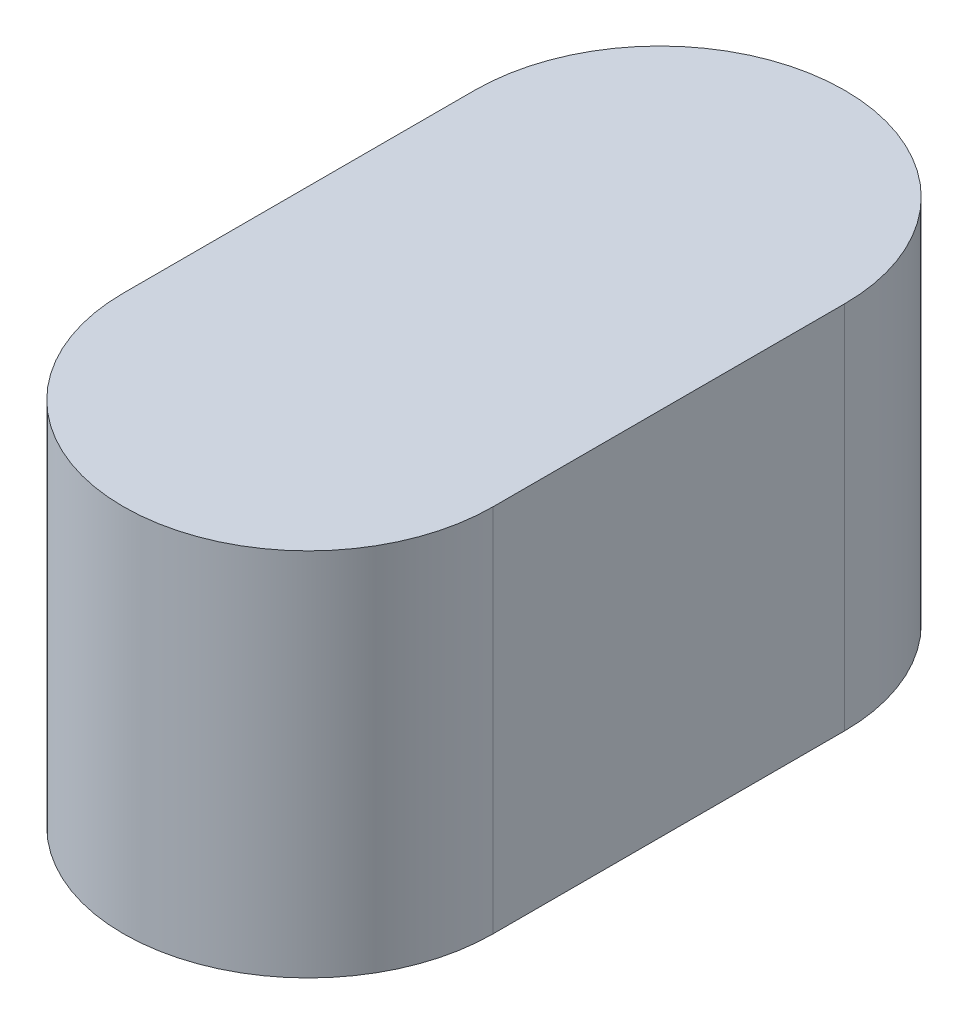
ISO-10303-21;
HEADER;
FILE_DESCRIPTION(('STEP AP214'),'2;1');
FILE_NAME('part.step','',(''),(''),'','','');
FILE_SCHEMA(('AUTOMOTIVE_DESIGN { 1 0 10303 214 1 1 1 1 }'));
ENDSEC;
DATA;
#1=APPLICATION_CONTEXT('core data for automotive mechanical design processes');
#2=APPLICATION_PROTOCOL_DEFINITION('international standard','automotive_design',2000,#1);
#3=PRODUCT_CONTEXT('',#1,'mechanical');
#4=PRODUCT('Part','Part','',(#3));
#5=PRODUCT_RELATED_PRODUCT_CATEGORY('part','',(#4));
#6=PRODUCT_DEFINITION_FORMATION('','',#4);
#7=PRODUCT_DEFINITION_CONTEXT('part definition',#1,'design');
#8=PRODUCT_DEFINITION('design','',#6,#7);
#9=PRODUCT_DEFINITION_SHAPE('','',#8);
#10=(LENGTH_UNIT() NAMED_UNIT(*) SI_UNIT(.MILLI.,.METRE.));
#11=(NAMED_UNIT(*) PLANE_ANGLE_UNIT() SI_UNIT($,.RADIAN.));
#12=(NAMED_UNIT(*) SI_UNIT($,.STERADIAN.) SOLID_ANGLE_UNIT());
#13=UNCERTAINTY_MEASURE_WITH_UNIT(LENGTH_MEASURE(1.E-05),#10,'distance_accuracy_value','');
#14=(GEOMETRIC_REPRESENTATION_CONTEXT(3) GLOBAL_UNCERTAINTY_ASSIGNED_CONTEXT((#13)) GLOBAL_UNIT_ASSIGNED_CONTEXT((#10,
#11,#12)) REPRESENTATION_CONTEXT('',''));
#15=CARTESIAN_POINT('',(0.,0.,0.));
#16=DIRECTION('',(0.,0.,1.));
#17=DIRECTION('',(1.,0.,0.));
#18=AXIS2_PLACEMENT_3D('',#15,#16,#17);
#19=CARTESIAN_POINT('',(0.,4.,-1.9));
#20=DIRECTION('',(0.,-1.,0.));
#21=DIRECTION('',(0.,0.,-1.));
#22=AXIS2_PLACEMENT_3D('',#19,#20,#21);
#23=CYLINDRICAL_SURFACE('',#22,2.);
#24=CARTESIAN_POINT('',(0.,0.,-1.9));
#25=DIRECTION('',(0.,1.,0.));
#26=DIRECTION('',(0.,0.,1.));
#27=AXIS2_PLACEMENT_3D('',#24,#25,#26);
#28=CIRCLE('',#27,2.);
#29=CARTESIAN_POINT('',(2.,0.,-1.9));
#30=VERTEX_POINT('',#29);
#31=CARTESIAN_POINT('',(-2.,0.,-1.9));
#32=VERTEX_POINT('',#31);
#33=EDGE_CURVE('E96',#30,#32,#28,.T.);
#34=ORIENTED_EDGE('',*,*,#33,.T.);
#35=DIRECTION('',(0.,-1.,0.));
#36=VECTOR('',#35,1.);
#37=CARTESIAN_POINT('',(-2.,4.,-1.9));
#38=LINE('',#37,#36);
#39=CARTESIAN_POINT('',(-2.,4.,-1.9));
#40=VERTEX_POINT('',#39);
#41=EDGE_CURVE('E11',#40,#32,#38,.T.);
#42=ORIENTED_EDGE('',*,*,#41,.F.);
#43=CARTESIAN_POINT('',(0.,4.,-1.9));
#44=DIRECTION('',(0.,1.,0.));
#45=DIRECTION('',(0.,0.,1.));
#46=AXIS2_PLACEMENT_3D('',#43,#44,#45);
#47=CIRCLE('',#46,2.);
#48=CARTESIAN_POINT('',(2.,4.,-1.9));
#49=VERTEX_POINT('',#48);
#50=EDGE_CURVE('E84',#49,#40,#47,.T.);
#51=ORIENTED_EDGE('',*,*,#50,.F.);
#52=DIRECTION('',(0.,-1.,0.));
#53=VECTOR('',#52,1.);
#54=CARTESIAN_POINT('',(2.,4.,-1.9));
#55=LINE('',#54,#53);
#56=EDGE_CURVE('E92',#49,#30,#55,.T.);
#57=ORIENTED_EDGE('',*,*,#56,.T.);
#58=EDGE_LOOP('',(#34,#42,#51,#57));
#59=FACE_BOUND('',#58,.T.);
#60=ADVANCED_FACE('F33',(#59),#23,.T.);
#61=CARTESIAN_POINT('',(-2.,4.,-1.9));
#62=DIRECTION('',(1.,0.,0.));
#63=DIRECTION('',(0.,0.,-1.));
#64=AXIS2_PLACEMENT_3D('',#61,#62,#63);
#65=PLANE('',#64);
#66=DIRECTION('',(0.,0.,1.));
#67=VECTOR('',#66,1.);
#68=CARTESIAN_POINT('',(-2.,0.,-1.9));
#69=LINE('',#68,#67);
#70=CARTESIAN_POINT('',(-2.,0.,1.9));
#71=VERTEX_POINT('',#70);
#72=EDGE_CURVE('E88',#32,#71,#69,.T.);
#73=ORIENTED_EDGE('',*,*,#72,.T.);
#74=DIRECTION('',(0.,-1.,0.));
#75=VECTOR('',#74,1.);
#76=CARTESIAN_POINT('',(-2.,4.,1.9));
#77=LINE('',#76,#75);
#78=CARTESIAN_POINT('',(-2.,4.,1.9));
#79=VERTEX_POINT('',#78);
#80=EDGE_CURVE('E41',#79,#71,#77,.T.);
#81=ORIENTED_EDGE('',*,*,#80,.F.);
#82=DIRECTION('',(0.,0.,1.));
#83=VECTOR('',#82,1.);
#84=CARTESIAN_POINT('',(-2.,4.,-1.9));
#85=LINE('',#84,#83);
#86=EDGE_CURVE('E79',#40,#79,#85,.T.);
#87=ORIENTED_EDGE('',*,*,#86,.F.);
#88=ORIENTED_EDGE('',*,*,#41,.T.);
#89=EDGE_LOOP('',(#73,#81,#87,#88));
#90=FACE_BOUND('',#89,.T.);
#91=ADVANCED_FACE('F87',(#90),#65,.F.);
#92=CARTESIAN_POINT('',(0.,4.,1.9));
#93=DIRECTION('',(0.,-1.,0.));
#94=DIRECTION('',(0.,0.,-1.));
#95=AXIS2_PLACEMENT_3D('',#92,#93,#94);
#96=CYLINDRICAL_SURFACE('',#95,2.);
#97=CARTESIAN_POINT('',(0.,0.,1.9));
#98=DIRECTION('',(0.,1.,0.));
#99=DIRECTION('',(0.,0.,1.));
#100=AXIS2_PLACEMENT_3D('',#97,#98,#99);
#101=CIRCLE('',#100,2.);
#102=CARTESIAN_POINT('',(2.,0.,1.9));
#103=VERTEX_POINT('',#102);
#104=EDGE_CURVE('E66',#71,#103,#101,.T.);
#105=ORIENTED_EDGE('',*,*,#104,.T.);
#106=DIRECTION('',(0.,-1.,0.));
#107=VECTOR('',#106,1.);
#108=CARTESIAN_POINT('',(2.,4.,1.9));
#109=LINE('',#108,#107);
#110=CARTESIAN_POINT('',(2.,4.,1.9));
#111=VERTEX_POINT('',#110);
#112=EDGE_CURVE('E89',#111,#103,#109,.T.);
#113=ORIENTED_EDGE('',*,*,#112,.F.);
#114=CARTESIAN_POINT('',(0.,4.,1.9));
#115=DIRECTION('',(0.,1.,0.));
#116=DIRECTION('',(0.,0.,1.));
#117=AXIS2_PLACEMENT_3D('',#114,#115,#116);
#118=CIRCLE('',#117,2.);
#119=EDGE_CURVE('E82',#79,#111,#118,.T.);
#120=ORIENTED_EDGE('',*,*,#119,.F.);
#121=ORIENTED_EDGE('',*,*,#80,.T.);
#122=EDGE_LOOP('',(#105,#113,#120,#121));
#123=FACE_BOUND('',#122,.T.);
#124=ADVANCED_FACE('F90',(#123),#96,.T.);
#125=CARTESIAN_POINT('',(2.,4.,-1.9));
#126=DIRECTION('',(-1.,0.,0.));
#127=DIRECTION('',(0.,0.,1.));
#128=AXIS2_PLACEMENT_3D('',#125,#126,#127);
#129=PLANE('',#128);
#130=DIRECTION('',(0.,0.,-1.));
#131=VECTOR('',#130,1.);
#132=CARTESIAN_POINT('',(2.,0.,-1.9));
#133=LINE('',#132,#131);
#134=EDGE_CURVE('E72',#103,#30,#133,.T.);
#135=ORIENTED_EDGE('',*,*,#134,.T.);
#136=ORIENTED_EDGE('',*,*,#56,.F.);
#137=DIRECTION('',(0.,0.,-1.));
#138=VECTOR('',#137,1.);
#139=CARTESIAN_POINT('',(2.,4.,-1.9));
#140=LINE('',#139,#138);
#141=EDGE_CURVE('E49',#111,#49,#140,.T.);
#142=ORIENTED_EDGE('',*,*,#141,.F.);
#143=ORIENTED_EDGE('',*,*,#112,.T.);
#144=EDGE_LOOP('',(#135,#136,#142,#143));
#145=FACE_BOUND('',#144,.T.);
#146=ADVANCED_FACE('F103',(#145),#129,.F.);
#147=CARTESIAN_POINT('',(0.,4.,-1.9));
#148=DIRECTION('',(0.,1.,0.));
#149=DIRECTION('',(0.,0.,1.));
#150=AXIS2_PLACEMENT_3D('',#147,#148,#149);
#151=PLANE('',#150);
#152=ORIENTED_EDGE('',*,*,#50,.T.);
#153=ORIENTED_EDGE('',*,*,#86,.T.);
#154=ORIENTED_EDGE('',*,*,#119,.T.);
#155=ORIENTED_EDGE('',*,*,#141,.T.);
#156=EDGE_LOOP('',(#152,#153,#154,#155));
#157=FACE_BOUND('',#156,.T.);
#158=ADVANCED_FACE('F80',(#157),#151,.T.);
#159=CARTESIAN_POINT('',(0.,0.,-1.9));
#160=DIRECTION('',(0.,1.,0.));
#161=DIRECTION('',(0.,0.,1.));
#162=AXIS2_PLACEMENT_3D('',#159,#160,#161);
#163=PLANE('',#162);
#164=ORIENTED_EDGE('',*,*,#33,.F.);
#165=ORIENTED_EDGE('',*,*,#134,.F.);
#166=ORIENTED_EDGE('',*,*,#104,.F.);
#167=ORIENTED_EDGE('',*,*,#72,.F.);
#168=EDGE_LOOP('',(#164,#165,#166,#167));
#169=FACE_BOUND('',#168,.T.);
#170=ADVANCED_FACE('F106',(#169),#163,.F.);
#171=CLOSED_SHELL('',(#60,#91,#124,#146,#158,#170));
#172=MANIFOLD_SOLID_BREP('B2',#171);
#173=ADVANCED_BREP_SHAPE_REPRESENTATION('',(#18,#172),#14);
#174=SHAPE_DEFINITION_REPRESENTATION(#9,#173);
ENDSEC;
END-ISO-10303-21;
